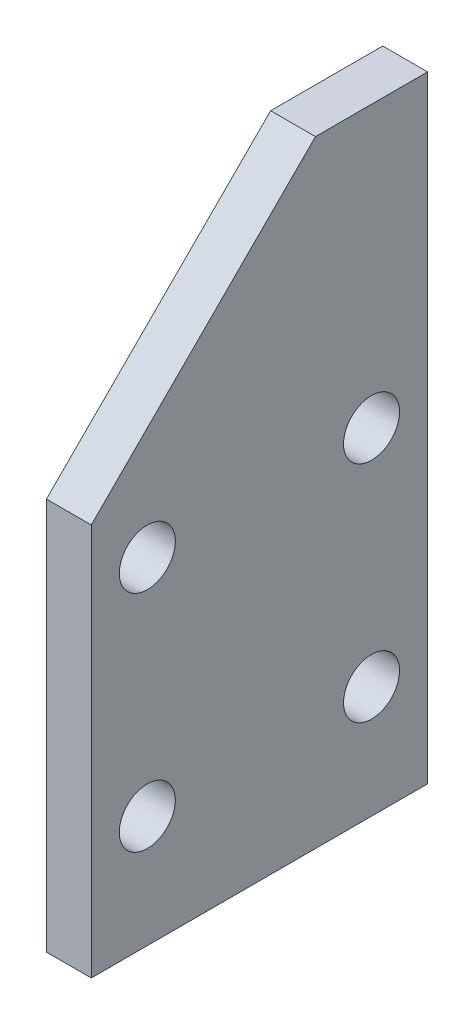
ISO-10303-21;
HEADER;
FILE_DESCRIPTION(('STEP AP214'),'2;1');
FILE_NAME('part.step','',(''),(''),'','','');
FILE_SCHEMA(('AUTOMOTIVE_DESIGN { 1 0 10303 214 1 1 1 1 }'));
ENDSEC;
DATA;
#1=APPLICATION_CONTEXT('core data for automotive mechanical design processes');
#2=APPLICATION_PROTOCOL_DEFINITION('international standard','automotive_design',2000,#1);
#3=PRODUCT_CONTEXT('',#1,'mechanical');
#4=PRODUCT('Part','Part','',(#3));
#5=PRODUCT_RELATED_PRODUCT_CATEGORY('part','',(#4));
#6=PRODUCT_DEFINITION_FORMATION('','',#4);
#7=PRODUCT_DEFINITION_CONTEXT('part definition',#1,'design');
#8=PRODUCT_DEFINITION('design','',#6,#7);
#9=PRODUCT_DEFINITION_SHAPE('','',#8);
#10=(LENGTH_UNIT() NAMED_UNIT(*) SI_UNIT(.MILLI.,.METRE.));
#11=(NAMED_UNIT(*) PLANE_ANGLE_UNIT() SI_UNIT($,.RADIAN.));
#12=(NAMED_UNIT(*) SI_UNIT($,.STERADIAN.) SOLID_ANGLE_UNIT());
#13=UNCERTAINTY_MEASURE_WITH_UNIT(LENGTH_MEASURE(1.E-05),#10,'distance_accuracy_value','');
#14=(GEOMETRIC_REPRESENTATION_CONTEXT(3) GLOBAL_UNCERTAINTY_ASSIGNED_CONTEXT((#13)) GLOBAL_UNIT_ASSIGNED_CONTEXT((#10,
#11,#12)) REPRESENTATION_CONTEXT('',''));
#15=CARTESIAN_POINT('',(0.,0.,0.));
#16=DIRECTION('',(0.,0.,1.));
#17=DIRECTION('',(1.,0.,0.));
#18=AXIS2_PLACEMENT_3D('',#15,#16,#17);
#19=CARTESIAN_POINT('',(4.,0.,0.));
#20=DIRECTION('',(-1.,0.,0.));
#21=DIRECTION('',(0.,0.,1.));
#22=AXIS2_PLACEMENT_3D('',#19,#20,#21);
#23=PLANE('',#22);
#24=DIRECTION('',(0.,-1.,0.));
#25=VECTOR('',#24,1.);
#26=CARTESIAN_POINT('',(4.,0.,0.));
#27=LINE('',#26,#25);
#28=CARTESIAN_POINT('',(4.,35.,0.));
#29=VERTEX_POINT('',#28);
#30=CARTESIAN_POINT('',(4.,0.,0.));
#31=VERTEX_POINT('',#30);
#32=EDGE_CURVE('E119',#29,#31,#27,.T.);
#33=ORIENTED_EDGE('',*,*,#32,.T.);
#34=DIRECTION('',(0.,0.,-1.));
#35=VECTOR('',#34,1.);
#36=CARTESIAN_POINT('',(4.,0.,0.));
#37=LINE('',#36,#35);
#38=CARTESIAN_POINT('',(4.,0.,-30.));
#39=VERTEX_POINT('',#38);
#40=EDGE_CURVE('E86',#31,#39,#37,.T.);
#41=ORIENTED_EDGE('',*,*,#40,.T.);
#42=DIRECTION('',(0.,1.,0.));
#43=VECTOR('',#42,1.);
#44=CARTESIAN_POINT('',(4.,0.,-30.));
#45=LINE('',#44,#43);
#46=CARTESIAN_POINT('',(4.,55.,-30.));
#47=VERTEX_POINT('',#46);
#48=EDGE_CURVE('E90',#39,#47,#45,.T.);
#49=ORIENTED_EDGE('',*,*,#48,.T.);
#50=DIRECTION('',(0.,0.,1.));
#51=VECTOR('',#50,1.);
#52=CARTESIAN_POINT('',(4.,55.,-20.));
#53=LINE('',#52,#51);
#54=CARTESIAN_POINT('',(4.,55.,-20.));
#55=VERTEX_POINT('',#54);
#56=EDGE_CURVE('E94',#47,#55,#53,.T.);
#57=ORIENTED_EDGE('',*,*,#56,.T.);
#58=DIRECTION('',(0.,-0.707106781186548,0.707106781186548));
#59=VECTOR('',#58,1.);
#60=CARTESIAN_POINT('',(4.,35.,0.));
#61=LINE('',#60,#59);
#62=EDGE_CURVE('E52',#55,#29,#61,.T.);
#63=ORIENTED_EDGE('',*,*,#62,.T.);
#64=EDGE_LOOP('',(#33,#41,#49,#57,#63));
#65=FACE_BOUND('',#64,.T.);
#66=CARTESIAN_POINT('',(4.,10.,-5.));
#67=DIRECTION('',(1.,0.,0.));
#68=DIRECTION('',(0.,0.,-1.));
#69=AXIS2_PLACEMENT_3D('',#66,#67,#68);
#70=CIRCLE('',#69,2.5);
#71=CARTESIAN_POINT('',(4.,10.,-7.5));
#72=VERTEX_POINT('',#71);
#73=EDGE_CURVE('E114',#72,#72,#70,.T.);
#74=ORIENTED_EDGE('',*,*,#73,.F.);
#75=EDGE_LOOP('',(#74));
#76=FACE_BOUND('',#75,.T.);
#77=CARTESIAN_POINT('',(4.,10.,-25.));
#78=DIRECTION('',(1.,0.,0.));
#79=DIRECTION('',(0.,0.,-1.));
#80=AXIS2_PLACEMENT_3D('',#77,#78,#79);
#81=CIRCLE('',#80,2.5);
#82=CARTESIAN_POINT('',(4.,10.,-27.5));
#83=VERTEX_POINT('',#82);
#84=EDGE_CURVE('E178',#83,#83,#81,.T.);
#85=ORIENTED_EDGE('',*,*,#84,.F.);
#86=EDGE_LOOP('',(#85));
#87=FACE_BOUND('',#86,.T.);
#88=CARTESIAN_POINT('',(4.,30.,-5.));
#89=DIRECTION('',(1.,0.,0.));
#90=DIRECTION('',(0.,0.,-1.));
#91=AXIS2_PLACEMENT_3D('',#88,#89,#90);
#92=CIRCLE('',#91,2.5);
#93=CARTESIAN_POINT('',(4.,30.,-7.5));
#94=VERTEX_POINT('',#93);
#95=EDGE_CURVE('E172',#94,#94,#92,.T.);
#96=ORIENTED_EDGE('',*,*,#95,.F.);
#97=EDGE_LOOP('',(#96));
#98=FACE_BOUND('',#97,.T.);
#99=CARTESIAN_POINT('',(4.,30.,-25.));
#100=DIRECTION('',(1.,0.,0.));
#101=DIRECTION('',(0.,0.,-1.));
#102=AXIS2_PLACEMENT_3D('',#99,#100,#101);
#103=CIRCLE('',#102,2.5);
#104=CARTESIAN_POINT('',(4.,30.,-27.5));
#105=VERTEX_POINT('',#104);
#106=EDGE_CURVE('E163',#105,#105,#103,.T.);
#107=ORIENTED_EDGE('',*,*,#106,.F.);
#108=EDGE_LOOP('',(#107));
#109=FACE_BOUND('',#108,.T.);
#110=ADVANCED_FACE('F35',(#65,#76,#87,#98,#109),#23,.F.);
#111=CARTESIAN_POINT('',(0.,0.,0.));
#112=DIRECTION('',(-1.,0.,0.));
#113=DIRECTION('',(0.,0.,1.));
#114=AXIS2_PLACEMENT_3D('',#111,#112,#113);
#115=PLANE('',#114);
#116=CARTESIAN_POINT('',(0.,30.,-5.));
#117=DIRECTION('',(1.,0.,0.));
#118=DIRECTION('',(0.,0.,-1.));
#119=AXIS2_PLACEMENT_3D('',#116,#117,#118);
#120=CIRCLE('',#119,2.5);
#121=CARTESIAN_POINT('',(0.,30.,-7.5));
#122=VERTEX_POINT('',#121);
#123=EDGE_CURVE('E169',#122,#122,#120,.T.);
#124=ORIENTED_EDGE('',*,*,#123,.T.);
#125=EDGE_LOOP('',(#124));
#126=FACE_BOUND('',#125,.T.);
#127=CARTESIAN_POINT('',(0.,10.,-5.));
#128=DIRECTION('',(1.,0.,0.));
#129=DIRECTION('',(0.,0.,-1.));
#130=AXIS2_PLACEMENT_3D('',#127,#128,#129);
#131=CIRCLE('',#130,2.5);
#132=CARTESIAN_POINT('',(0.,10.,-7.5));
#133=VERTEX_POINT('',#132);
#134=EDGE_CURVE('E181',#133,#133,#131,.T.);
#135=ORIENTED_EDGE('',*,*,#134,.T.);
#136=EDGE_LOOP('',(#135));
#137=FACE_BOUND('',#136,.T.);
#138=DIRECTION('',(0.,-1.,0.));
#139=VECTOR('',#138,1.);
#140=CARTESIAN_POINT('',(0.,0.,0.));
#141=LINE('',#140,#139);
#142=CARTESIAN_POINT('',(0.,35.,0.));
#143=VERTEX_POINT('',#142);
#144=CARTESIAN_POINT('',(0.,0.,0.));
#145=VERTEX_POINT('',#144);
#146=EDGE_CURVE('E110',#143,#145,#141,.T.);
#147=ORIENTED_EDGE('',*,*,#146,.F.);
#148=DIRECTION('',(0.,-0.707106781186548,0.707106781186548));
#149=VECTOR('',#148,1.);
#150=CARTESIAN_POINT('',(0.,35.,0.));
#151=LINE('',#150,#149);
#152=CARTESIAN_POINT('',(0.,55.,-20.));
#153=VERTEX_POINT('',#152);
#154=EDGE_CURVE('E78',#153,#143,#151,.T.);
#155=ORIENTED_EDGE('',*,*,#154,.F.);
#156=DIRECTION('',(0.,0.,1.));
#157=VECTOR('',#156,1.);
#158=CARTESIAN_POINT('',(0.,55.,-20.));
#159=LINE('',#158,#157);
#160=CARTESIAN_POINT('',(0.,55.,-30.));
#161=VERTEX_POINT('',#160);
#162=EDGE_CURVE('E72',#161,#153,#159,.T.);
#163=ORIENTED_EDGE('',*,*,#162,.F.);
#164=DIRECTION('',(0.,1.,0.));
#165=VECTOR('',#164,1.);
#166=CARTESIAN_POINT('',(0.,0.,-30.));
#167=LINE('',#166,#165);
#168=CARTESIAN_POINT('',(0.,0.,-30.));
#169=VERTEX_POINT('',#168);
#170=EDGE_CURVE('E101',#169,#161,#167,.T.);
#171=ORIENTED_EDGE('',*,*,#170,.F.);
#172=DIRECTION('',(0.,0.,-1.));
#173=VECTOR('',#172,1.);
#174=CARTESIAN_POINT('',(0.,0.,0.));
#175=LINE('',#174,#173);
#176=EDGE_CURVE('E113',#145,#169,#175,.T.);
#177=ORIENTED_EDGE('',*,*,#176,.F.);
#178=EDGE_LOOP('',(#147,#155,#163,#171,#177));
#179=FACE_BOUND('',#178,.T.);
#180=CARTESIAN_POINT('',(0.,10.,-25.));
#181=DIRECTION('',(1.,0.,0.));
#182=DIRECTION('',(0.,0.,-1.));
#183=AXIS2_PLACEMENT_3D('',#180,#181,#182);
#184=CIRCLE('',#183,2.5);
#185=CARTESIAN_POINT('',(0.,10.,-27.5));
#186=VERTEX_POINT('',#185);
#187=EDGE_CURVE('E175',#186,#186,#184,.T.);
#188=ORIENTED_EDGE('',*,*,#187,.T.);
#189=EDGE_LOOP('',(#188));
#190=FACE_BOUND('',#189,.T.);
#191=CARTESIAN_POINT('',(0.,30.,-25.));
#192=DIRECTION('',(1.,0.,0.));
#193=DIRECTION('',(0.,0.,-1.));
#194=AXIS2_PLACEMENT_3D('',#191,#192,#193);
#195=CIRCLE('',#194,2.5);
#196=CARTESIAN_POINT('',(0.,30.,-27.5));
#197=VERTEX_POINT('',#196);
#198=EDGE_CURVE('E166',#197,#197,#195,.T.);
#199=ORIENTED_EDGE('',*,*,#198,.T.);
#200=EDGE_LOOP('',(#199));
#201=FACE_BOUND('',#200,.T.);
#202=ADVANCED_FACE('F123',(#126,#137,#179,#190,#201),#115,.T.);
#203=CARTESIAN_POINT('',(4.,0.,0.));
#204=DIRECTION('',(0.,0.,-1.));
#205=DIRECTION('',(-1.,0.,0.));
#206=AXIS2_PLACEMENT_3D('',#203,#204,#205);
#207=PLANE('',#206);
#208=ORIENTED_EDGE('',*,*,#146,.T.);
#209=DIRECTION('',(-1.,0.,0.));
#210=VECTOR('',#209,1.);
#211=CARTESIAN_POINT('',(4.,0.,0.));
#212=LINE('',#211,#210);
#213=EDGE_CURVE('E11',#31,#145,#212,.T.);
#214=ORIENTED_EDGE('',*,*,#213,.F.);
#215=ORIENTED_EDGE('',*,*,#32,.F.);
#216=DIRECTION('',(-1.,0.,0.));
#217=VECTOR('',#216,1.);
#218=CARTESIAN_POINT('',(4.,35.,0.));
#219=LINE('',#218,#217);
#220=EDGE_CURVE('E106',#29,#143,#219,.T.);
#221=ORIENTED_EDGE('',*,*,#220,.T.);
#222=EDGE_LOOP('',(#208,#214,#215,#221));
#223=FACE_BOUND('',#222,.T.);
#224=ADVANCED_FACE('F37',(#223),#207,.F.);
#225=CARTESIAN_POINT('',(4.,0.,0.));
#226=DIRECTION('',(0.,1.,0.));
#227=DIRECTION('',(0.,0.,1.));
#228=AXIS2_PLACEMENT_3D('',#225,#226,#227);
#229=PLANE('',#228);
#230=ORIENTED_EDGE('',*,*,#176,.T.);
#231=DIRECTION('',(-1.,0.,0.));
#232=VECTOR('',#231,1.);
#233=CARTESIAN_POINT('',(4.,0.,-30.));
#234=LINE('',#233,#232);
#235=EDGE_CURVE('E44',#39,#169,#234,.T.);
#236=ORIENTED_EDGE('',*,*,#235,.F.);
#237=ORIENTED_EDGE('',*,*,#40,.F.);
#238=ORIENTED_EDGE('',*,*,#213,.T.);
#239=EDGE_LOOP('',(#230,#236,#237,#238));
#240=FACE_BOUND('',#239,.T.);
#241=ADVANCED_FACE('F232',(#240),#229,.F.);
#242=CARTESIAN_POINT('',(4.,0.,-30.));
#243=DIRECTION('',(0.,0.,1.));
#244=DIRECTION('',(1.,0.,0.));
#245=AXIS2_PLACEMENT_3D('',#242,#243,#244);
#246=PLANE('',#245);
#247=ORIENTED_EDGE('',*,*,#170,.T.);
#248=DIRECTION('',(-1.,0.,0.));
#249=VECTOR('',#248,1.);
#250=CARTESIAN_POINT('',(4.,55.,-30.));
#251=LINE('',#250,#249);
#252=EDGE_CURVE('E98',#47,#161,#251,.T.);
#253=ORIENTED_EDGE('',*,*,#252,.F.);
#254=ORIENTED_EDGE('',*,*,#48,.F.);
#255=ORIENTED_EDGE('',*,*,#235,.T.);
#256=EDGE_LOOP('',(#247,#253,#254,#255));
#257=FACE_BOUND('',#256,.T.);
#258=ADVANCED_FACE('F99',(#257),#246,.F.);
#259=CARTESIAN_POINT('',(4.,55.,-20.));
#260=DIRECTION('',(0.,-1.,0.));
#261=DIRECTION('',(0.,0.,-1.));
#262=AXIS2_PLACEMENT_3D('',#259,#260,#261);
#263=PLANE('',#262);
#264=ORIENTED_EDGE('',*,*,#162,.T.);
#265=DIRECTION('',(-1.,0.,0.));
#266=VECTOR('',#265,1.);
#267=CARTESIAN_POINT('',(4.,55.,-20.));
#268=LINE('',#267,#266);
#269=EDGE_CURVE('E102',#55,#153,#268,.T.);
#270=ORIENTED_EDGE('',*,*,#269,.F.);
#271=ORIENTED_EDGE('',*,*,#56,.F.);
#272=ORIENTED_EDGE('',*,*,#252,.T.);
#273=EDGE_LOOP('',(#264,#270,#271,#272));
#274=FACE_BOUND('',#273,.T.);
#275=ADVANCED_FACE('F104',(#274),#263,.F.);
#276=CARTESIAN_POINT('',(4.,35.,0.));
#277=DIRECTION('',(0.,-0.707106781186547,-0.707106781186547));
#278=DIRECTION('',(0.,0.707106781186548,-0.707106781186548));
#279=AXIS2_PLACEMENT_3D('',#276,#277,#278);
#280=PLANE('',#279);
#281=ORIENTED_EDGE('',*,*,#154,.T.);
#282=ORIENTED_EDGE('',*,*,#220,.F.);
#283=ORIENTED_EDGE('',*,*,#62,.F.);
#284=ORIENTED_EDGE('',*,*,#269,.T.);
#285=EDGE_LOOP('',(#281,#282,#283,#284));
#286=FACE_BOUND('',#285,.T.);
#287=ADVANCED_FACE('F128',(#286),#280,.F.);
#288=CARTESIAN_POINT('',(4.,10.,-5.));
#289=DIRECTION('',(-1.,0.,0.));
#290=DIRECTION('',(0.,0.,1.));
#291=AXIS2_PLACEMENT_3D('',#288,#289,#290);
#292=CYLINDRICAL_SURFACE('',#291,2.5);
#293=ORIENTED_EDGE('',*,*,#73,.T.);
#294=EDGE_LOOP('',(#293));
#295=FACE_BOUND('',#294,.T.);
#296=ORIENTED_EDGE('',*,*,#134,.F.);
#297=EDGE_LOOP('',(#296));
#298=FACE_BOUND('',#297,.T.);
#299=ADVANCED_FACE('F130',(#295,#298),#292,.F.);
#300=CARTESIAN_POINT('',(4.,10.,-25.));
#301=DIRECTION('',(-1.,0.,0.));
#302=DIRECTION('',(0.,0.,1.));
#303=AXIS2_PLACEMENT_3D('',#300,#301,#302);
#304=CYLINDRICAL_SURFACE('',#303,2.5);
#305=ORIENTED_EDGE('',*,*,#84,.T.);
#306=EDGE_LOOP('',(#305));
#307=FACE_BOUND('',#306,.T.);
#308=ORIENTED_EDGE('',*,*,#187,.F.);
#309=EDGE_LOOP('',(#308));
#310=FACE_BOUND('',#309,.T.);
#311=ADVANCED_FACE('F136',(#307,#310),#304,.F.);
#312=CARTESIAN_POINT('',(4.,30.,-5.));
#313=DIRECTION('',(-1.,0.,0.));
#314=DIRECTION('',(0.,0.,1.));
#315=AXIS2_PLACEMENT_3D('',#312,#313,#314);
#316=CYLINDRICAL_SURFACE('',#315,2.5);
#317=ORIENTED_EDGE('',*,*,#95,.T.);
#318=EDGE_LOOP('',(#317));
#319=FACE_BOUND('',#318,.T.);
#320=ORIENTED_EDGE('',*,*,#123,.F.);
#321=EDGE_LOOP('',(#320));
#322=FACE_BOUND('',#321,.T.);
#323=ADVANCED_FACE('F150',(#319,#322),#316,.F.);
#324=CARTESIAN_POINT('',(4.,30.,-25.));
#325=DIRECTION('',(-1.,0.,0.));
#326=DIRECTION('',(0.,0.,1.));
#327=AXIS2_PLACEMENT_3D('',#324,#325,#326);
#328=CYLINDRICAL_SURFACE('',#327,2.5);
#329=ORIENTED_EDGE('',*,*,#106,.T.);
#330=EDGE_LOOP('',(#329));
#331=FACE_BOUND('',#330,.T.);
#332=ORIENTED_EDGE('',*,*,#198,.F.);
#333=EDGE_LOOP('',(#332));
#334=FACE_BOUND('',#333,.T.);
#335=ADVANCED_FACE('F154',(#331,#334),#328,.F.);
#336=CLOSED_SHELL('',(#110,#202,#224,#241,#258,#275,#287,#299,#311,#323,#335));
#337=MANIFOLD_SOLID_BREP('B2',#336);
#338=ADVANCED_BREP_SHAPE_REPRESENTATION('',(#18,#337),#14);
#339=SHAPE_DEFINITION_REPRESENTATION(#9,#338);
ENDSEC;
END-ISO-10303-21;
